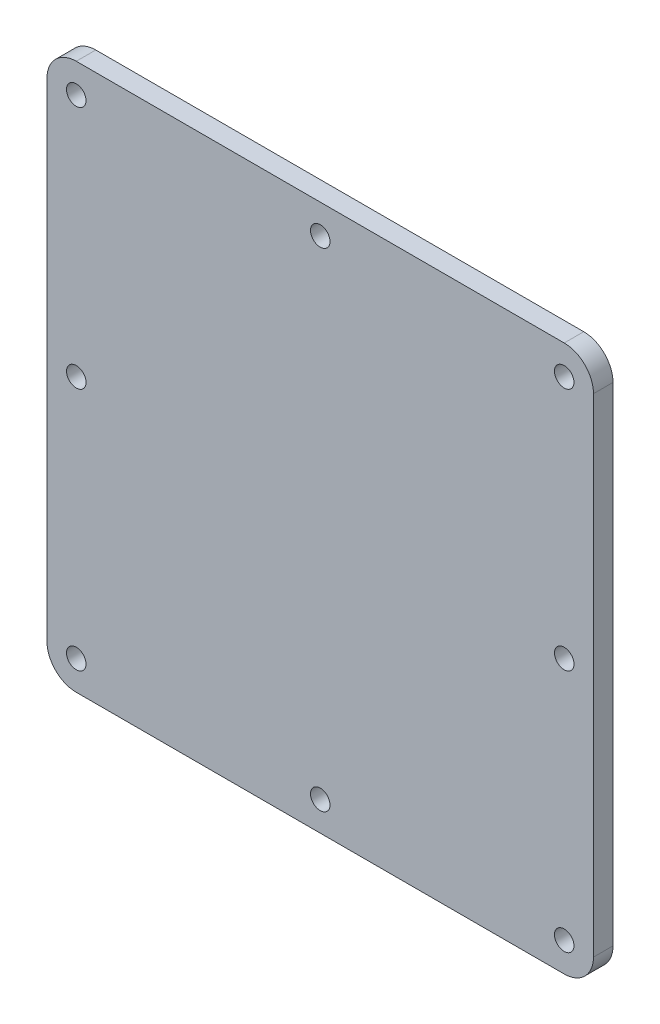
ISO-10303-21;
HEADER;
FILE_DESCRIPTION(('STEP AP214'),'2;1');
FILE_NAME('part.step','',(''),(''),'','','');
FILE_SCHEMA(('AUTOMOTIVE_DESIGN { 1 0 10303 214 1 1 1 1 }'));
ENDSEC;
DATA;
#1=APPLICATION_CONTEXT('core data for automotive mechanical design processes');
#2=APPLICATION_PROTOCOL_DEFINITION('international standard','automotive_design',2000,#1);
#3=PRODUCT_CONTEXT('',#1,'mechanical');
#4=PRODUCT('Part','Part','',(#3));
#5=PRODUCT_RELATED_PRODUCT_CATEGORY('part','',(#4));
#6=PRODUCT_DEFINITION_FORMATION('','',#4);
#7=PRODUCT_DEFINITION_CONTEXT('part definition',#1,'design');
#8=PRODUCT_DEFINITION('design','',#6,#7);
#9=PRODUCT_DEFINITION_SHAPE('','',#8);
#10=(LENGTH_UNIT() NAMED_UNIT(*) SI_UNIT(.MILLI.,.METRE.));
#11=(NAMED_UNIT(*) PLANE_ANGLE_UNIT() SI_UNIT($,.RADIAN.));
#12=(NAMED_UNIT(*) SI_UNIT($,.STERADIAN.) SOLID_ANGLE_UNIT());
#13=UNCERTAINTY_MEASURE_WITH_UNIT(LENGTH_MEASURE(1.E-05),#10,'distance_accuracy_value','');
#14=(GEOMETRIC_REPRESENTATION_CONTEXT(3) GLOBAL_UNCERTAINTY_ASSIGNED_CONTEXT((#13)) GLOBAL_UNIT_ASSIGNED_CONTEXT((#10,
#11,#12)) REPRESENTATION_CONTEXT('',''));
#15=CARTESIAN_POINT('',(0.,0.,0.));
#16=DIRECTION('',(0.,0.,1.));
#17=DIRECTION('',(1.,0.,0.));
#18=AXIS2_PLACEMENT_3D('',#15,#16,#17);
#19=CARTESIAN_POINT('',(-125.,-125.,10.));
#20=DIRECTION('',(0.,0.,1.));
#21=DIRECTION('',(1.,0.,0.));
#22=AXIS2_PLACEMENT_3D('',#19,#20,#21);
#23=PLANE('',#22);
#24=CARTESIAN_POINT('',(0.,-125.,10.));
#25=DIRECTION('',(0.,0.,1.));
#26=DIRECTION('',(1.,0.,0.));
#27=AXIS2_PLACEMENT_3D('',#24,#25,#26);
#28=CIRCLE('',#27,5.);
#29=CARTESIAN_POINT('',(5.,-125.,10.));
#30=VERTEX_POINT('',#29);
#31=EDGE_CURVE('E212',#30,#30,#28,.T.);
#32=ORIENTED_EDGE('',*,*,#31,.F.);
#33=EDGE_LOOP('',(#32));
#34=FACE_BOUND('',#33,.T.);
#35=CARTESIAN_POINT('',(-125.,0.,10.));
#36=DIRECTION('',(0.,0.,1.));
#37=DIRECTION('',(1.,0.,0.));
#38=AXIS2_PLACEMENT_3D('',#35,#36,#37);
#39=CIRCLE('',#38,5.);
#40=CARTESIAN_POINT('',(-120.,0.,10.));
#41=VERTEX_POINT('',#40);
#42=EDGE_CURVE('E200',#41,#41,#39,.T.);
#43=ORIENTED_EDGE('',*,*,#42,.F.);
#44=EDGE_LOOP('',(#43));
#45=FACE_BOUND('',#44,.T.);
#46=CARTESIAN_POINT('',(125.,125.,10.));
#47=DIRECTION('',(0.,0.,1.));
#48=DIRECTION('',(1.,0.,0.));
#49=AXIS2_PLACEMENT_3D('',#46,#47,#48);
#50=CIRCLE('',#49,4.99999999999999);
#51=CARTESIAN_POINT('',(130.,125.,10.));
#52=VERTEX_POINT('',#51);
#53=EDGE_CURVE('E188',#52,#52,#50,.T.);
#54=ORIENTED_EDGE('',*,*,#53,.F.);
#55=EDGE_LOOP('',(#54));
#56=FACE_BOUND('',#55,.T.);
#57=CARTESIAN_POINT('',(-125.,125.,10.));
#58=DIRECTION('',(0.,0.,1.));
#59=DIRECTION('',(1.,0.,0.));
#60=AXIS2_PLACEMENT_3D('',#57,#58,#59);
#61=CIRCLE('',#60,5.00000000000001);
#62=CARTESIAN_POINT('',(-120.,125.,10.));
#63=VERTEX_POINT('',#62);
#64=EDGE_CURVE('E134',#63,#63,#61,.T.);
#65=ORIENTED_EDGE('',*,*,#64,.F.);
#66=EDGE_LOOP('',(#65));
#67=FACE_BOUND('',#66,.T.);
#68=CARTESIAN_POINT('',(-125.,-125.,10.));
#69=DIRECTION('',(0.,0.,1.));
#70=DIRECTION('',(1.,0.,0.));
#71=AXIS2_PLACEMENT_3D('',#68,#69,#70);
#72=CIRCLE('',#71,15.);
#73=CARTESIAN_POINT('',(-140.,-125.,10.));
#74=VERTEX_POINT('',#73);
#75=CARTESIAN_POINT('',(-125.,-140.,10.));
#76=VERTEX_POINT('',#75);
#77=EDGE_CURVE('E145',#74,#76,#72,.T.);
#78=ORIENTED_EDGE('',*,*,#77,.T.);
#79=DIRECTION('',(1.,0.,0.));
#80=VECTOR('',#79,1.);
#81=CARTESIAN_POINT('',(-125.,-140.,10.));
#82=LINE('',#81,#80);
#83=CARTESIAN_POINT('',(125.,-140.,10.));
#84=VERTEX_POINT('',#83);
#85=EDGE_CURVE('E93',#76,#84,#82,.T.);
#86=ORIENTED_EDGE('',*,*,#85,.T.);
#87=CARTESIAN_POINT('',(125.,-125.,10.));
#88=DIRECTION('',(0.,0.,1.));
#89=DIRECTION('',(1.,0.,0.));
#90=AXIS2_PLACEMENT_3D('',#87,#88,#89);
#91=CIRCLE('',#90,15.);
#92=CARTESIAN_POINT('',(140.,-125.,10.));
#93=VERTEX_POINT('',#92);
#94=EDGE_CURVE('E160',#84,#93,#91,.T.);
#95=ORIENTED_EDGE('',*,*,#94,.T.);
#96=DIRECTION('',(0.,1.,0.));
#97=VECTOR('',#96,1.);
#98=CARTESIAN_POINT('',(140.,125.,10.));
#99=LINE('',#98,#97);
#100=CARTESIAN_POINT('',(140.,125.,10.));
#101=VERTEX_POINT('',#100);
#102=EDGE_CURVE('E173',#93,#101,#99,.T.);
#103=ORIENTED_EDGE('',*,*,#102,.T.);
#104=CARTESIAN_POINT('',(125.,125.,10.));
#105=DIRECTION('',(0.,0.,1.));
#106=DIRECTION('',(-1.,0.,0.));
#107=AXIS2_PLACEMENT_3D('',#104,#105,#106);
#108=CIRCLE('',#107,15.);
#109=CARTESIAN_POINT('',(125.,140.,10.));
#110=VERTEX_POINT('',#109);
#111=EDGE_CURVE('E112',#101,#110,#108,.T.);
#112=ORIENTED_EDGE('',*,*,#111,.T.);
#113=DIRECTION('',(-1.,0.,0.));
#114=VECTOR('',#113,1.);
#115=CARTESIAN_POINT('',(-125.,140.,10.));
#116=LINE('',#115,#114);
#117=CARTESIAN_POINT('',(-125.,140.,10.));
#118=VERTEX_POINT('',#117);
#119=EDGE_CURVE('E106',#110,#118,#116,.T.);
#120=ORIENTED_EDGE('',*,*,#119,.T.);
#121=CARTESIAN_POINT('',(-125.,125.,10.));
#122=DIRECTION('',(0.,0.,1.));
#123=DIRECTION('',(1.,0.,0.));
#124=AXIS2_PLACEMENT_3D('',#121,#122,#123);
#125=CIRCLE('',#124,15.);
#126=CARTESIAN_POINT('',(-140.,125.,10.));
#127=VERTEX_POINT('',#126);
#128=EDGE_CURVE('E110',#118,#127,#125,.T.);
#129=ORIENTED_EDGE('',*,*,#128,.T.);
#130=DIRECTION('',(0.,-1.,0.));
#131=VECTOR('',#130,1.);
#132=CARTESIAN_POINT('',(-140.,125.,10.));
#133=LINE('',#132,#131);
#134=EDGE_CURVE('E50',#127,#74,#133,.T.);
#135=ORIENTED_EDGE('',*,*,#134,.T.);
#136=EDGE_LOOP('',(#78,#86,#95,#103,#112,#120,#129,#135));
#137=FACE_BOUND('',#136,.T.);
#138=CARTESIAN_POINT('',(0.,125.,10.));
#139=DIRECTION('',(0.,0.,1.));
#140=DIRECTION('',(1.,0.,0.));
#141=AXIS2_PLACEMENT_3D('',#138,#139,#140);
#142=CIRCLE('',#141,5.);
#143=CARTESIAN_POINT('',(4.99999999999999,125.,10.));
#144=VERTEX_POINT('',#143);
#145=EDGE_CURVE('E182',#144,#144,#142,.T.);
#146=ORIENTED_EDGE('',*,*,#145,.F.);
#147=EDGE_LOOP('',(#146));
#148=FACE_BOUND('',#147,.T.);
#149=CARTESIAN_POINT('',(125.,0.,10.));
#150=DIRECTION('',(0.,0.,1.));
#151=DIRECTION('',(1.,0.,0.));
#152=AXIS2_PLACEMENT_3D('',#149,#150,#151);
#153=CIRCLE('',#152,5.00000000000001);
#154=CARTESIAN_POINT('',(130.,0.,10.));
#155=VERTEX_POINT('',#154);
#156=EDGE_CURVE('E194',#155,#155,#153,.T.);
#157=ORIENTED_EDGE('',*,*,#156,.F.);
#158=EDGE_LOOP('',(#157));
#159=FACE_BOUND('',#158,.T.);
#160=CARTESIAN_POINT('',(-125.,-125.,10.));
#161=DIRECTION('',(0.,0.,1.));
#162=DIRECTION('',(1.,0.,0.));
#163=AXIS2_PLACEMENT_3D('',#160,#161,#162);
#164=CIRCLE('',#163,5.00000000000001);
#165=CARTESIAN_POINT('',(-120.,-125.,10.));
#166=VERTEX_POINT('',#165);
#167=EDGE_CURVE('E206',#166,#166,#164,.T.);
#168=ORIENTED_EDGE('',*,*,#167,.F.);
#169=EDGE_LOOP('',(#168));
#170=FACE_BOUND('',#169,.T.);
#171=CARTESIAN_POINT('',(125.,-125.,10.));
#172=DIRECTION('',(0.,0.,1.));
#173=DIRECTION('',(1.,0.,0.));
#174=AXIS2_PLACEMENT_3D('',#171,#172,#173);
#175=CIRCLE('',#174,5.00000000000002);
#176=CARTESIAN_POINT('',(130.,-125.,10.));
#177=VERTEX_POINT('',#176);
#178=EDGE_CURVE('E218',#177,#177,#175,.T.);
#179=ORIENTED_EDGE('',*,*,#178,.F.);
#180=EDGE_LOOP('',(#179));
#181=FACE_BOUND('',#180,.T.);
#182=ADVANCED_FACE('F33',(#34,#45,#56,#67,#137,#148,#159,#170,#181),#23,.T.);
#183=CARTESIAN_POINT('',(-125.,-125.,0.));
#184=DIRECTION('',(0.,0.,1.));
#185=DIRECTION('',(1.,0.,0.));
#186=AXIS2_PLACEMENT_3D('',#183,#184,#185);
#187=PLANE('',#186);
#188=CARTESIAN_POINT('',(-125.,-125.,0.));
#189=DIRECTION('',(0.,0.,1.));
#190=DIRECTION('',(1.,0.,0.));
#191=AXIS2_PLACEMENT_3D('',#188,#189,#190);
#192=CIRCLE('',#191,15.);
#193=CARTESIAN_POINT('',(-140.,-125.,0.));
#194=VERTEX_POINT('',#193);
#195=CARTESIAN_POINT('',(-125.,-140.,0.));
#196=VERTEX_POINT('',#195);
#197=EDGE_CURVE('E130',#194,#196,#192,.T.);
#198=ORIENTED_EDGE('',*,*,#197,.F.);
#199=DIRECTION('',(0.,-1.,0.));
#200=VECTOR('',#199,1.);
#201=CARTESIAN_POINT('',(-140.,125.,0.));
#202=LINE('',#201,#200);
#203=CARTESIAN_POINT('',(-140.,125.,0.));
#204=VERTEX_POINT('',#203);
#205=EDGE_CURVE('E85',#204,#194,#202,.T.);
#206=ORIENTED_EDGE('',*,*,#205,.F.);
#207=CARTESIAN_POINT('',(-125.,125.,0.));
#208=DIRECTION('',(0.,0.,1.));
#209=DIRECTION('',(1.,0.,0.));
#210=AXIS2_PLACEMENT_3D('',#207,#208,#209);
#211=CIRCLE('',#210,15.);
#212=CARTESIAN_POINT('',(-125.,140.,0.));
#213=VERTEX_POINT('',#212);
#214=EDGE_CURVE('E79',#213,#204,#211,.T.);
#215=ORIENTED_EDGE('',*,*,#214,.F.);
#216=DIRECTION('',(-1.,0.,0.));
#217=VECTOR('',#216,1.);
#218=CARTESIAN_POINT('',(-125.,140.,0.));
#219=LINE('',#218,#217);
#220=CARTESIAN_POINT('',(125.,140.,0.));
#221=VERTEX_POINT('',#220);
#222=EDGE_CURVE('E120',#221,#213,#219,.T.);
#223=ORIENTED_EDGE('',*,*,#222,.F.);
#224=CARTESIAN_POINT('',(125.,125.,0.));
#225=DIRECTION('',(0.,0.,1.));
#226=DIRECTION('',(-1.,0.,0.));
#227=AXIS2_PLACEMENT_3D('',#224,#225,#226);
#228=CIRCLE('',#227,15.);
#229=CARTESIAN_POINT('',(140.,125.,0.));
#230=VERTEX_POINT('',#229);
#231=EDGE_CURVE('E140',#230,#221,#228,.T.);
#232=ORIENTED_EDGE('',*,*,#231,.F.);
#233=DIRECTION('',(0.,1.,0.));
#234=VECTOR('',#233,1.);
#235=CARTESIAN_POINT('',(140.,125.,0.));
#236=LINE('',#235,#234);
#237=CARTESIAN_POINT('',(140.,-125.,0.));
#238=VERTEX_POINT('',#237);
#239=EDGE_CURVE('E138',#238,#230,#236,.T.);
#240=ORIENTED_EDGE('',*,*,#239,.F.);
#241=CARTESIAN_POINT('',(125.,-125.,0.));
#242=DIRECTION('',(0.,0.,1.));
#243=DIRECTION('',(1.,0.,0.));
#244=AXIS2_PLACEMENT_3D('',#241,#242,#243);
#245=CIRCLE('',#244,15.);
#246=CARTESIAN_POINT('',(125.,-140.,0.));
#247=VERTEX_POINT('',#246);
#248=EDGE_CURVE('E136',#247,#238,#245,.T.);
#249=ORIENTED_EDGE('',*,*,#248,.F.);
#250=DIRECTION('',(1.,0.,0.));
#251=VECTOR('',#250,1.);
#252=CARTESIAN_POINT('',(-125.,-140.,0.));
#253=LINE('',#252,#251);
#254=EDGE_CURVE('E133',#196,#247,#253,.T.);
#255=ORIENTED_EDGE('',*,*,#254,.F.);
#256=EDGE_LOOP('',(#198,#206,#215,#223,#232,#240,#249,#255));
#257=FACE_BOUND('',#256,.T.);
#258=CARTESIAN_POINT('',(-125.,125.,0.));
#259=DIRECTION('',(0.,0.,1.));
#260=DIRECTION('',(1.,0.,0.));
#261=AXIS2_PLACEMENT_3D('',#258,#259,#260);
#262=CIRCLE('',#261,5.00000000000001);
#263=CARTESIAN_POINT('',(-120.,125.,0.));
#264=VERTEX_POINT('',#263);
#265=EDGE_CURVE('E179',#264,#264,#262,.T.);
#266=ORIENTED_EDGE('',*,*,#265,.T.);
#267=EDGE_LOOP('',(#266));
#268=FACE_BOUND('',#267,.T.);
#269=CARTESIAN_POINT('',(0.,125.,0.));
#270=DIRECTION('',(0.,0.,1.));
#271=DIRECTION('',(1.,0.,0.));
#272=AXIS2_PLACEMENT_3D('',#269,#270,#271);
#273=CIRCLE('',#272,5.);
#274=CARTESIAN_POINT('',(4.99999999999999,125.,0.));
#275=VERTEX_POINT('',#274);
#276=EDGE_CURVE('E185',#275,#275,#273,.T.);
#277=ORIENTED_EDGE('',*,*,#276,.T.);
#278=EDGE_LOOP('',(#277));
#279=FACE_BOUND('',#278,.T.);
#280=CARTESIAN_POINT('',(125.,125.,0.));
#281=DIRECTION('',(0.,0.,1.));
#282=DIRECTION('',(1.,0.,0.));
#283=AXIS2_PLACEMENT_3D('',#280,#281,#282);
#284=CIRCLE('',#283,4.99999999999999);
#285=CARTESIAN_POINT('',(130.,125.,0.));
#286=VERTEX_POINT('',#285);
#287=EDGE_CURVE('E191',#286,#286,#284,.T.);
#288=ORIENTED_EDGE('',*,*,#287,.T.);
#289=EDGE_LOOP('',(#288));
#290=FACE_BOUND('',#289,.T.);
#291=CARTESIAN_POINT('',(125.,0.,0.));
#292=DIRECTION('',(0.,0.,1.));
#293=DIRECTION('',(1.,0.,0.));
#294=AXIS2_PLACEMENT_3D('',#291,#292,#293);
#295=CIRCLE('',#294,5.00000000000001);
#296=CARTESIAN_POINT('',(130.,0.,0.));
#297=VERTEX_POINT('',#296);
#298=EDGE_CURVE('E197',#297,#297,#295,.T.);
#299=ORIENTED_EDGE('',*,*,#298,.T.);
#300=EDGE_LOOP('',(#299));
#301=FACE_BOUND('',#300,.T.);
#302=CARTESIAN_POINT('',(-125.,0.,0.));
#303=DIRECTION('',(0.,0.,1.));
#304=DIRECTION('',(1.,0.,0.));
#305=AXIS2_PLACEMENT_3D('',#302,#303,#304);
#306=CIRCLE('',#305,5.);
#307=CARTESIAN_POINT('',(-120.,0.,0.));
#308=VERTEX_POINT('',#307);
#309=EDGE_CURVE('E203',#308,#308,#306,.T.);
#310=ORIENTED_EDGE('',*,*,#309,.T.);
#311=EDGE_LOOP('',(#310));
#312=FACE_BOUND('',#311,.T.);
#313=CARTESIAN_POINT('',(-125.,-125.,0.));
#314=DIRECTION('',(0.,0.,1.));
#315=DIRECTION('',(1.,0.,0.));
#316=AXIS2_PLACEMENT_3D('',#313,#314,#315);
#317=CIRCLE('',#316,5.00000000000001);
#318=CARTESIAN_POINT('',(-120.,-125.,0.));
#319=VERTEX_POINT('',#318);
#320=EDGE_CURVE('E209',#319,#319,#317,.T.);
#321=ORIENTED_EDGE('',*,*,#320,.T.);
#322=EDGE_LOOP('',(#321));
#323=FACE_BOUND('',#322,.T.);
#324=CARTESIAN_POINT('',(0.,-125.,0.));
#325=DIRECTION('',(0.,0.,1.));
#326=DIRECTION('',(1.,0.,0.));
#327=AXIS2_PLACEMENT_3D('',#324,#325,#326);
#328=CIRCLE('',#327,5.);
#329=CARTESIAN_POINT('',(5.,-125.,0.));
#330=VERTEX_POINT('',#329);
#331=EDGE_CURVE('E215',#330,#330,#328,.T.);
#332=ORIENTED_EDGE('',*,*,#331,.T.);
#333=EDGE_LOOP('',(#332));
#334=FACE_BOUND('',#333,.T.);
#335=CARTESIAN_POINT('',(125.,-125.,0.));
#336=DIRECTION('',(0.,0.,1.));
#337=DIRECTION('',(1.,0.,0.));
#338=AXIS2_PLACEMENT_3D('',#335,#336,#337);
#339=CIRCLE('',#338,5.00000000000002);
#340=CARTESIAN_POINT('',(130.,-125.,0.));
#341=VERTEX_POINT('',#340);
#342=EDGE_CURVE('E221',#341,#341,#339,.T.);
#343=ORIENTED_EDGE('',*,*,#342,.T.);
#344=EDGE_LOOP('',(#343));
#345=FACE_BOUND('',#344,.T.);
#346=ADVANCED_FACE('F164',(#257,#268,#279,#290,#301,#312,#323,#334,#345),#187,.F.);
#347=CARTESIAN_POINT('',(-125.,-125.,10.));
#348=DIRECTION('',(0.,0.,-1.));
#349=DIRECTION('',(-1.,0.,0.));
#350=AXIS2_PLACEMENT_3D('',#347,#348,#349);
#351=CYLINDRICAL_SURFACE('',#350,15.);
#352=ORIENTED_EDGE('',*,*,#197,.T.);
#353=DIRECTION('',(0.,0.,-1.));
#354=VECTOR('',#353,1.);
#355=CARTESIAN_POINT('',(-125.,-140.,10.));
#356=LINE('',#355,#354);
#357=EDGE_CURVE('E11',#76,#196,#356,.T.);
#358=ORIENTED_EDGE('',*,*,#357,.F.);
#359=ORIENTED_EDGE('',*,*,#77,.F.);
#360=DIRECTION('',(0.,0.,-1.));
#361=VECTOR('',#360,1.);
#362=CARTESIAN_POINT('',(-140.,-125.,10.));
#363=LINE('',#362,#361);
#364=EDGE_CURVE('E126',#74,#194,#363,.T.);
#365=ORIENTED_EDGE('',*,*,#364,.T.);
#366=EDGE_LOOP('',(#352,#358,#359,#365));
#367=FACE_BOUND('',#366,.T.);
#368=ADVANCED_FACE('F35',(#367),#351,.T.);
#369=CARTESIAN_POINT('',(-125.,-140.,10.));
#370=DIRECTION('',(0.,1.,0.));
#371=DIRECTION('',(0.,0.,1.));
#372=AXIS2_PLACEMENT_3D('',#369,#370,#371);
#373=PLANE('',#372);
#374=ORIENTED_EDGE('',*,*,#254,.T.);
#375=DIRECTION('',(0.,0.,-1.));
#376=VECTOR('',#375,1.);
#377=CARTESIAN_POINT('',(125.,-140.,10.));
#378=LINE('',#377,#376);
#379=EDGE_CURVE('E42',#84,#247,#378,.T.);
#380=ORIENTED_EDGE('',*,*,#379,.F.);
#381=ORIENTED_EDGE('',*,*,#85,.F.);
#382=ORIENTED_EDGE('',*,*,#357,.T.);
#383=EDGE_LOOP('',(#374,#380,#381,#382));
#384=FACE_BOUND('',#383,.T.);
#385=ADVANCED_FACE('F255',(#384),#373,.F.);
#386=CARTESIAN_POINT('',(125.,-125.,10.));
#387=DIRECTION('',(0.,0.,-1.));
#388=DIRECTION('',(-1.,0.,0.));
#389=AXIS2_PLACEMENT_3D('',#386,#387,#388);
#390=CYLINDRICAL_SURFACE('',#389,15.);
#391=ORIENTED_EDGE('',*,*,#248,.T.);
#392=DIRECTION('',(0.,0.,-1.));
#393=VECTOR('',#392,1.);
#394=CARTESIAN_POINT('',(140.,-125.,10.));
#395=LINE('',#394,#393);
#396=EDGE_CURVE('E152',#93,#238,#395,.T.);
#397=ORIENTED_EDGE('',*,*,#396,.F.);
#398=ORIENTED_EDGE('',*,*,#94,.F.);
#399=ORIENTED_EDGE('',*,*,#379,.T.);
#400=EDGE_LOOP('',(#391,#397,#398,#399));
#401=FACE_BOUND('',#400,.T.);
#402=ADVANCED_FACE('F158',(#401),#390,.T.);
#403=CARTESIAN_POINT('',(140.,125.,10.));
#404=DIRECTION('',(-1.,0.,0.));
#405=DIRECTION('',(0.,0.,1.));
#406=AXIS2_PLACEMENT_3D('',#403,#404,#405);
#407=PLANE('',#406);
#408=ORIENTED_EDGE('',*,*,#239,.T.);
#409=DIRECTION('',(0.,0.,-1.));
#410=VECTOR('',#409,1.);
#411=CARTESIAN_POINT('',(140.,125.,10.));
#412=LINE('',#411,#410);
#413=EDGE_CURVE('E149',#101,#230,#412,.T.);
#414=ORIENTED_EDGE('',*,*,#413,.F.);
#415=ORIENTED_EDGE('',*,*,#102,.F.);
#416=ORIENTED_EDGE('',*,*,#396,.T.);
#417=EDGE_LOOP('',(#408,#414,#415,#416));
#418=FACE_BOUND('',#417,.T.);
#419=ADVANCED_FACE('F169',(#418),#407,.F.);
#420=CARTESIAN_POINT('',(125.,125.,10.));
#421=DIRECTION('',(0.,0.,-1.));
#422=DIRECTION('',(-1.,0.,0.));
#423=AXIS2_PLACEMENT_3D('',#420,#421,#422);
#424=CYLINDRICAL_SURFACE('',#423,15.);
#425=ORIENTED_EDGE('',*,*,#231,.T.);
#426=DIRECTION('',(0.,0.,-1.));
#427=VECTOR('',#426,1.);
#428=CARTESIAN_POINT('',(125.,140.,10.));
#429=LINE('',#428,#427);
#430=EDGE_CURVE('E121',#110,#221,#429,.T.);
#431=ORIENTED_EDGE('',*,*,#430,.F.);
#432=ORIENTED_EDGE('',*,*,#111,.F.);
#433=ORIENTED_EDGE('',*,*,#413,.T.);
#434=EDGE_LOOP('',(#425,#431,#432,#433));
#435=FACE_BOUND('',#434,.T.);
#436=ADVANCED_FACE('F172',(#435),#424,.T.);
#437=CARTESIAN_POINT('',(-125.,140.,10.));
#438=DIRECTION('',(0.,-1.,0.));
#439=DIRECTION('',(0.,0.,-1.));
#440=AXIS2_PLACEMENT_3D('',#437,#438,#439);
#441=PLANE('',#440);
#442=ORIENTED_EDGE('',*,*,#222,.T.);
#443=DIRECTION('',(0.,0.,-1.));
#444=VECTOR('',#443,1.);
#445=CARTESIAN_POINT('',(-125.,140.,10.));
#446=LINE('',#445,#444);
#447=EDGE_CURVE('E117',#118,#213,#446,.T.);
#448=ORIENTED_EDGE('',*,*,#447,.F.);
#449=ORIENTED_EDGE('',*,*,#119,.F.);
#450=ORIENTED_EDGE('',*,*,#430,.T.);
#451=EDGE_LOOP('',(#442,#448,#449,#450));
#452=FACE_BOUND('',#451,.T.);
#453=ADVANCED_FACE('F118',(#452),#441,.F.);
#454=CARTESIAN_POINT('',(-125.,125.,10.));
#455=DIRECTION('',(0.,0.,-1.));
#456=DIRECTION('',(-1.,0.,0.));
#457=AXIS2_PLACEMENT_3D('',#454,#455,#456);
#458=CYLINDRICAL_SURFACE('',#457,15.);
#459=ORIENTED_EDGE('',*,*,#214,.T.);
#460=DIRECTION('',(0.,0.,-1.));
#461=VECTOR('',#460,1.);
#462=CARTESIAN_POINT('',(-140.,125.,10.));
#463=LINE('',#462,#461);
#464=EDGE_CURVE('E122',#127,#204,#463,.T.);
#465=ORIENTED_EDGE('',*,*,#464,.F.);
#466=ORIENTED_EDGE('',*,*,#128,.F.);
#467=ORIENTED_EDGE('',*,*,#447,.T.);
#468=EDGE_LOOP('',(#459,#465,#466,#467));
#469=FACE_BOUND('',#468,.T.);
#470=ADVANCED_FACE('F124',(#469),#458,.T.);
#471=CARTESIAN_POINT('',(-140.,125.,10.));
#472=DIRECTION('',(1.,0.,0.));
#473=DIRECTION('',(0.,0.,-1.));
#474=AXIS2_PLACEMENT_3D('',#471,#472,#473);
#475=PLANE('',#474);
#476=ORIENTED_EDGE('',*,*,#205,.T.);
#477=ORIENTED_EDGE('',*,*,#364,.F.);
#478=ORIENTED_EDGE('',*,*,#134,.F.);
#479=ORIENTED_EDGE('',*,*,#464,.T.);
#480=EDGE_LOOP('',(#476,#477,#478,#479));
#481=FACE_BOUND('',#480,.T.);
#482=ADVANCED_FACE('F243',(#481),#475,.F.);
#483=CARTESIAN_POINT('',(-125.,125.,10.));
#484=DIRECTION('',(0.,0.,-1.));
#485=DIRECTION('',(-1.,0.,0.));
#486=AXIS2_PLACEMENT_3D('',#483,#484,#485);
#487=CYLINDRICAL_SURFACE('',#486,5.00000000000001);
#488=ORIENTED_EDGE('',*,*,#64,.T.);
#489=EDGE_LOOP('',(#488));
#490=FACE_BOUND('',#489,.T.);
#491=ORIENTED_EDGE('',*,*,#265,.F.);
#492=EDGE_LOOP('',(#491));
#493=FACE_BOUND('',#492,.T.);
#494=ADVANCED_FACE('F240',(#490,#493),#487,.F.);
#495=CARTESIAN_POINT('',(0.,125.,10.));
#496=DIRECTION('',(0.,0.,-1.));
#497=DIRECTION('',(-1.,0.,0.));
#498=AXIS2_PLACEMENT_3D('',#495,#496,#497);
#499=CYLINDRICAL_SURFACE('',#498,5.);
#500=ORIENTED_EDGE('',*,*,#145,.T.);
#501=EDGE_LOOP('',(#500));
#502=FACE_BOUND('',#501,.T.);
#503=ORIENTED_EDGE('',*,*,#276,.F.);
#504=EDGE_LOOP('',(#503));
#505=FACE_BOUND('',#504,.T.);
#506=ADVANCED_FACE('F319',(#502,#505),#499,.F.);
#507=CARTESIAN_POINT('',(125.,125.,10.));
#508=DIRECTION('',(0.,0.,-1.));
#509=DIRECTION('',(-1.,0.,0.));
#510=AXIS2_PLACEMENT_3D('',#507,#508,#509);
#511=CYLINDRICAL_SURFACE('',#510,4.99999999999999);
#512=ORIENTED_EDGE('',*,*,#53,.T.);
#513=EDGE_LOOP('',(#512));
#514=FACE_BOUND('',#513,.T.);
#515=ORIENTED_EDGE('',*,*,#287,.F.);
#516=EDGE_LOOP('',(#515));
#517=FACE_BOUND('',#516,.T.);
#518=ADVANCED_FACE('F327',(#514,#517),#511,.F.);
#519=CARTESIAN_POINT('',(125.,0.,10.));
#520=DIRECTION('',(0.,0.,-1.));
#521=DIRECTION('',(-1.,0.,0.));
#522=AXIS2_PLACEMENT_3D('',#519,#520,#521);
#523=CYLINDRICAL_SURFACE('',#522,5.00000000000001);
#524=ORIENTED_EDGE('',*,*,#156,.T.);
#525=EDGE_LOOP('',(#524));
#526=FACE_BOUND('',#525,.T.);
#527=ORIENTED_EDGE('',*,*,#298,.F.);
#528=EDGE_LOOP('',(#527));
#529=FACE_BOUND('',#528,.T.);
#530=ADVANCED_FACE('F335',(#526,#529),#523,.F.);
#531=CARTESIAN_POINT('',(-125.,0.,10.));
#532=DIRECTION('',(0.,0.,-1.));
#533=DIRECTION('',(-1.,0.,0.));
#534=AXIS2_PLACEMENT_3D('',#531,#532,#533);
#535=CYLINDRICAL_SURFACE('',#534,5.);
#536=ORIENTED_EDGE('',*,*,#42,.T.);
#537=EDGE_LOOP('',(#536));
#538=FACE_BOUND('',#537,.T.);
#539=ORIENTED_EDGE('',*,*,#309,.F.);
#540=EDGE_LOOP('',(#539));
#541=FACE_BOUND('',#540,.T.);
#542=ADVANCED_FACE('F344',(#538,#541),#535,.F.);
#543=CARTESIAN_POINT('',(-125.,-125.,10.));
#544=DIRECTION('',(0.,0.,-1.));
#545=DIRECTION('',(-1.,0.,0.));
#546=AXIS2_PLACEMENT_3D('',#543,#544,#545);
#547=CYLINDRICAL_SURFACE('',#546,5.00000000000001);
#548=ORIENTED_EDGE('',*,*,#167,.T.);
#549=EDGE_LOOP('',(#548));
#550=FACE_BOUND('',#549,.T.);
#551=ORIENTED_EDGE('',*,*,#320,.F.);
#552=EDGE_LOOP('',(#551));
#553=FACE_BOUND('',#552,.T.);
#554=ADVANCED_FACE('F353',(#550,#553),#547,.F.);
#555=CARTESIAN_POINT('',(0.,-125.,10.));
#556=DIRECTION('',(0.,0.,-1.));
#557=DIRECTION('',(-1.,0.,0.));
#558=AXIS2_PLACEMENT_3D('',#555,#556,#557);
#559=CYLINDRICAL_SURFACE('',#558,5.);
#560=ORIENTED_EDGE('',*,*,#31,.T.);
#561=EDGE_LOOP('',(#560));
#562=FACE_BOUND('',#561,.T.);
#563=ORIENTED_EDGE('',*,*,#331,.F.);
#564=EDGE_LOOP('',(#563));
#565=FACE_BOUND('',#564,.T.);
#566=ADVANCED_FACE('F362',(#562,#565),#559,.F.);
#567=CARTESIAN_POINT('',(125.,-125.,10.));
#568=DIRECTION('',(0.,0.,-1.));
#569=DIRECTION('',(-1.,0.,0.));
#570=AXIS2_PLACEMENT_3D('',#567,#568,#569);
#571=CYLINDRICAL_SURFACE('',#570,5.00000000000002);
#572=ORIENTED_EDGE('',*,*,#178,.T.);
#573=EDGE_LOOP('',(#572));
#574=FACE_BOUND('',#573,.T.);
#575=ORIENTED_EDGE('',*,*,#342,.F.);
#576=EDGE_LOOP('',(#575));
#577=FACE_BOUND('',#576,.T.);
#578=ADVANCED_FACE('F227',(#574,#577),#571,.F.);
#579=CLOSED_SHELL('',(#182,#346,#368,#385,#402,#419,#436,#453,#470,#482,#494,#506,#518,#530,
#542,#554,#566,#578));
#580=MANIFOLD_SOLID_BREP('B2',#579);
#581=ADVANCED_BREP_SHAPE_REPRESENTATION('',(#18,#580),#14);
#582=SHAPE_DEFINITION_REPRESENTATION(#9,#581);
ENDSEC;
END-ISO-10303-21;
